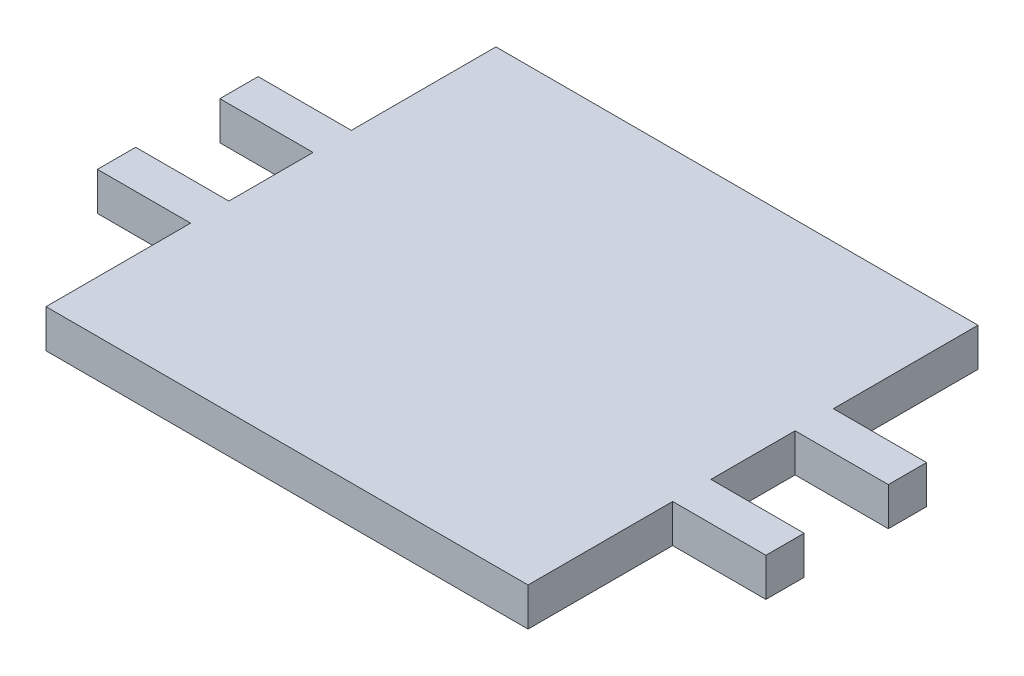
ISO-10303-21;
HEADER;
FILE_DESCRIPTION(('STEP AP214'),'2;1');
FILE_NAME('part.step','',(''),(''),'','','');
FILE_SCHEMA(('AUTOMOTIVE_DESIGN { 1 0 10303 214 1 1 1 1 }'));
ENDSEC;
DATA;
#1=APPLICATION_CONTEXT('core data for automotive mechanical design processes');
#2=APPLICATION_PROTOCOL_DEFINITION('international standard','automotive_design',2000,#1);
#3=PRODUCT_CONTEXT('',#1,'mechanical');
#4=PRODUCT('Part','Part','',(#3));
#5=PRODUCT_RELATED_PRODUCT_CATEGORY('part','',(#4));
#6=PRODUCT_DEFINITION_FORMATION('','',#4);
#7=PRODUCT_DEFINITION_CONTEXT('part definition',#1,'design');
#8=PRODUCT_DEFINITION('design','',#6,#7);
#9=PRODUCT_DEFINITION_SHAPE('','',#8);
#10=(LENGTH_UNIT() NAMED_UNIT(*) SI_UNIT(.MILLI.,.METRE.));
#11=(NAMED_UNIT(*) PLANE_ANGLE_UNIT() SI_UNIT($,.RADIAN.));
#12=(NAMED_UNIT(*) SI_UNIT($,.STERADIAN.) SOLID_ANGLE_UNIT());
#13=UNCERTAINTY_MEASURE_WITH_UNIT(LENGTH_MEASURE(1.E-05),#10,'distance_accuracy_value','');
#14=(GEOMETRIC_REPRESENTATION_CONTEXT(3) GLOBAL_UNCERTAINTY_ASSIGNED_CONTEXT((#13)) GLOBAL_UNIT_ASSIGNED_CONTEXT((#10,
#11,#12)) REPRESENTATION_CONTEXT('',''));
#15=CARTESIAN_POINT('',(0.,0.,0.));
#16=DIRECTION('',(0.,0.,1.));
#17=DIRECTION('',(1.,0.,0.));
#18=AXIS2_PLACEMENT_3D('',#15,#16,#17);
#19=CARTESIAN_POINT('',(38.1,6.0452,0.));
#20=DIRECTION('',(1.,0.,0.));
#21=DIRECTION('',(0.,0.,-1.));
#22=AXIS2_PLACEMENT_3D('',#19,#20,#21);
#23=PLANE('',#22);
#24=DIRECTION('',(0.,0.,1.));
#25=VECTOR('',#24,1.);
#26=CARTESIAN_POINT('',(38.1,0.,0.));
#27=LINE('',#26,#25);
#28=CARTESIAN_POINT('',(38.1,0.,-35.56));
#29=VERTEX_POINT('',#28);
#30=CARTESIAN_POINT('',(38.1,0.,-12.7));
#31=VERTEX_POINT('',#30);
#32=EDGE_CURVE('E219',#29,#31,#27,.T.);
#33=ORIENTED_EDGE('',*,*,#32,.F.);
#34=DIRECTION('',(0.,-1.,0.));
#35=VECTOR('',#34,1.);
#36=CARTESIAN_POINT('',(38.1,6.0452,-35.56));
#37=LINE('',#36,#35);
#38=CARTESIAN_POINT('',(38.1,6.0452,-35.56));
#39=VERTEX_POINT('',#38);
#40=EDGE_CURVE('E11',#39,#29,#37,.T.);
#41=ORIENTED_EDGE('',*,*,#40,.F.);
#42=DIRECTION('',(0.,0.,1.));
#43=VECTOR('',#42,1.);
#44=CARTESIAN_POINT('',(38.1,6.0452,0.));
#45=LINE('',#44,#43);
#46=CARTESIAN_POINT('',(38.1,6.0452,-12.7));
#47=VERTEX_POINT('',#46);
#48=EDGE_CURVE('E279',#39,#47,#45,.T.);
#49=ORIENTED_EDGE('',*,*,#48,.T.);
#50=DIRECTION('',(0.,-1.,0.));
#51=VECTOR('',#50,1.);
#52=CARTESIAN_POINT('',(38.1,6.0452,-12.7));
#53=LINE('',#52,#51);
#54=EDGE_CURVE('E137',#47,#31,#53,.T.);
#55=ORIENTED_EDGE('',*,*,#54,.T.);
#56=EDGE_LOOP('',(#33,#41,#49,#55));
#57=FACE_BOUND('',#56,.T.);
#58=ADVANCED_FACE('F49',(#57),#23,.T.);
#59=CARTESIAN_POINT('',(0.,6.0452,-35.56));
#60=DIRECTION('',(0.,0.,-1.));
#61=DIRECTION('',(-1.,0.,0.));
#62=AXIS2_PLACEMENT_3D('',#59,#60,#61);
#63=PLANE('',#62);
#64=DIRECTION('',(1.,0.,0.));
#65=VECTOR('',#64,1.);
#66=CARTESIAN_POINT('',(0.,0.,-35.56));
#67=LINE('',#66,#65);
#68=CARTESIAN_POINT('',(-38.1,0.,-35.56));
#69=VERTEX_POINT('',#68);
#70=EDGE_CURVE('E223',#69,#29,#67,.T.);
#71=ORIENTED_EDGE('',*,*,#70,.F.);
#72=DIRECTION('',(0.,-1.,0.));
#73=VECTOR('',#72,1.);
#74=CARTESIAN_POINT('',(-38.1,6.0452,-35.56));
#75=LINE('',#74,#73);
#76=CARTESIAN_POINT('',(-38.1,6.0452,-35.56));
#77=VERTEX_POINT('',#76);
#78=EDGE_CURVE('E59',#77,#69,#75,.T.);
#79=ORIENTED_EDGE('',*,*,#78,.F.);
#80=DIRECTION('',(1.,0.,0.));
#81=VECTOR('',#80,1.);
#82=CARTESIAN_POINT('',(0.,6.0452,-35.56));
#83=LINE('',#82,#81);
#84=EDGE_CURVE('E347',#77,#39,#83,.T.);
#85=ORIENTED_EDGE('',*,*,#84,.T.);
#86=ORIENTED_EDGE('',*,*,#40,.T.);
#87=EDGE_LOOP('',(#71,#79,#85,#86));
#88=FACE_BOUND('',#87,.T.);
#89=ADVANCED_FACE('F51',(#88),#63,.T.);
#90=CARTESIAN_POINT('',(-38.1,6.0452,0.));
#91=DIRECTION('',(1.,0.,0.));
#92=DIRECTION('',(0.,0.,-1.));
#93=AXIS2_PLACEMENT_3D('',#90,#91,#92);
#94=PLANE('',#93);
#95=DIRECTION('',(0.,0.,1.));
#96=VECTOR('',#95,1.);
#97=CARTESIAN_POINT('',(-38.1,0.,0.));
#98=LINE('',#97,#96);
#99=CARTESIAN_POINT('',(-38.1,0.,-12.7));
#100=VERTEX_POINT('',#99);
#101=EDGE_CURVE('E229',#69,#100,#98,.T.);
#102=ORIENTED_EDGE('',*,*,#101,.T.);
#103=DIRECTION('',(0.,-1.,0.));
#104=VECTOR('',#103,1.);
#105=CARTESIAN_POINT('',(-38.1,6.0452,-12.7));
#106=LINE('',#105,#104);
#107=CARTESIAN_POINT('',(-38.1,6.0452,-12.7));
#108=VERTEX_POINT('',#107);
#109=EDGE_CURVE('E330',#108,#100,#106,.T.);
#110=ORIENTED_EDGE('',*,*,#109,.F.);
#111=DIRECTION('',(0.,0.,1.));
#112=VECTOR('',#111,1.);
#113=CARTESIAN_POINT('',(-38.1,6.0452,0.));
#114=LINE('',#113,#112);
#115=EDGE_CURVE('E338',#77,#108,#114,.T.);
#116=ORIENTED_EDGE('',*,*,#115,.F.);
#117=ORIENTED_EDGE('',*,*,#78,.T.);
#118=EDGE_LOOP('',(#102,#110,#116,#117));
#119=FACE_BOUND('',#118,.T.);
#120=ADVANCED_FACE('F336',(#119),#94,.F.);
#121=CARTESIAN_POINT('',(0.,6.0452,-12.7));
#122=DIRECTION('',(0.,0.,-1.));
#123=DIRECTION('',(-1.,0.,0.));
#124=AXIS2_PLACEMENT_3D('',#121,#122,#123);
#125=PLANE('',#124);
#126=DIRECTION('',(1.,0.,0.));
#127=VECTOR('',#126,1.);
#128=CARTESIAN_POINT('',(0.,0.,-12.7));
#129=LINE('',#128,#127);
#130=CARTESIAN_POINT('',(-52.832,0.,-12.7));
#131=VERTEX_POINT('',#130);
#132=EDGE_CURVE('E233',#131,#100,#129,.T.);
#133=ORIENTED_EDGE('',*,*,#132,.F.);
#134=DIRECTION('',(0.,-1.,0.));
#135=VECTOR('',#134,1.);
#136=CARTESIAN_POINT('',(-52.832,6.0452,-12.7));
#137=LINE('',#136,#135);
#138=CARTESIAN_POINT('',(-52.832,6.0452,-12.7));
#139=VERTEX_POINT('',#138);
#140=EDGE_CURVE('E327',#139,#131,#137,.T.);
#141=ORIENTED_EDGE('',*,*,#140,.F.);
#142=DIRECTION('',(1.,0.,0.));
#143=VECTOR('',#142,1.);
#144=CARTESIAN_POINT('',(0.,6.0452,-12.7));
#145=LINE('',#144,#143);
#146=EDGE_CURVE('E438',#139,#108,#145,.T.);
#147=ORIENTED_EDGE('',*,*,#146,.T.);
#148=ORIENTED_EDGE('',*,*,#109,.T.);
#149=EDGE_LOOP('',(#133,#141,#147,#148));
#150=FACE_BOUND('',#149,.T.);
#151=ADVANCED_FACE('F444',(#150),#125,.T.);
#152=CARTESIAN_POINT('',(-52.832,6.0452,0.));
#153=DIRECTION('',(1.,0.,0.));
#154=DIRECTION('',(0.,0.,-1.));
#155=AXIS2_PLACEMENT_3D('',#152,#153,#154);
#156=PLANE('',#155);
#157=DIRECTION('',(0.,0.,1.));
#158=VECTOR('',#157,1.);
#159=CARTESIAN_POINT('',(-52.832,0.,0.));
#160=LINE('',#159,#158);
#161=CARTESIAN_POINT('',(-52.832,0.,-6.6548));
#162=VERTEX_POINT('',#161);
#163=EDGE_CURVE('E239',#131,#162,#160,.T.);
#164=ORIENTED_EDGE('',*,*,#163,.T.);
#165=DIRECTION('',(0.,-1.,0.));
#166=VECTOR('',#165,1.);
#167=CARTESIAN_POINT('',(-52.832,6.0452,-6.6548));
#168=LINE('',#167,#166);
#169=CARTESIAN_POINT('',(-52.832,6.0452,-6.6548));
#170=VERTEX_POINT('',#169);
#171=EDGE_CURVE('E323',#170,#162,#168,.T.);
#172=ORIENTED_EDGE('',*,*,#171,.F.);
#173=DIRECTION('',(0.,0.,1.));
#174=VECTOR('',#173,1.);
#175=CARTESIAN_POINT('',(-52.832,6.0452,0.));
#176=LINE('',#175,#174);
#177=EDGE_CURVE('E435',#139,#170,#176,.T.);
#178=ORIENTED_EDGE('',*,*,#177,.F.);
#179=ORIENTED_EDGE('',*,*,#140,.T.);
#180=EDGE_LOOP('',(#164,#172,#178,#179));
#181=FACE_BOUND('',#180,.T.);
#182=ADVANCED_FACE('F448',(#181),#156,.F.);
#183=CARTESIAN_POINT('',(0.,6.0452,-6.6548));
#184=DIRECTION('',(0.,0.,-1.));
#185=DIRECTION('',(-1.,0.,0.));
#186=AXIS2_PLACEMENT_3D('',#183,#184,#185);
#187=PLANE('',#186);
#188=DIRECTION('',(1.,0.,0.));
#189=VECTOR('',#188,1.);
#190=CARTESIAN_POINT('',(0.,0.,-6.6548));
#191=LINE('',#190,#189);
#192=CARTESIAN_POINT('',(-38.1,0.,-6.6548));
#193=VERTEX_POINT('',#192);
#194=EDGE_CURVE('E242',#162,#193,#191,.T.);
#195=ORIENTED_EDGE('',*,*,#194,.T.);
#196=DIRECTION('',(0.,-1.,0.));
#197=VECTOR('',#196,1.);
#198=CARTESIAN_POINT('',(-38.1,6.0452,-6.6548));
#199=LINE('',#198,#197);
#200=CARTESIAN_POINT('',(-38.1,6.0452,-6.6548));
#201=VERTEX_POINT('',#200);
#202=EDGE_CURVE('E319',#201,#193,#199,.T.);
#203=ORIENTED_EDGE('',*,*,#202,.F.);
#204=DIRECTION('',(1.,0.,0.));
#205=VECTOR('',#204,1.);
#206=CARTESIAN_POINT('',(0.,6.0452,-6.6548));
#207=LINE('',#206,#205);
#208=EDGE_CURVE('E431',#170,#201,#207,.T.);
#209=ORIENTED_EDGE('',*,*,#208,.F.);
#210=ORIENTED_EDGE('',*,*,#171,.T.);
#211=EDGE_LOOP('',(#195,#203,#209,#210));
#212=FACE_BOUND('',#211,.T.);
#213=ADVANCED_FACE('F451',(#212),#187,.F.);
#214=CARTESIAN_POINT('',(-38.1,0.,6.6548));
#215=VERTEX_POINT('',#214);
#216=EDGE_CURVE('E235',#193,#215,#98,.T.);
#217=ORIENTED_EDGE('',*,*,#216,.T.);
#218=DIRECTION('',(0.,-1.,0.));
#219=VECTOR('',#218,1.);
#220=CARTESIAN_POINT('',(-38.1,6.0452,6.6548));
#221=LINE('',#220,#219);
#222=CARTESIAN_POINT('',(-38.1,6.0452,6.6548));
#223=VERTEX_POINT('',#222);
#224=EDGE_CURVE('E316',#223,#215,#221,.T.);
#225=ORIENTED_EDGE('',*,*,#224,.F.);
#226=EDGE_CURVE('E374',#201,#223,#114,.T.);
#227=ORIENTED_EDGE('',*,*,#226,.F.);
#228=ORIENTED_EDGE('',*,*,#202,.T.);
#229=EDGE_LOOP('',(#217,#225,#227,#228));
#230=FACE_BOUND('',#229,.T.);
#231=ADVANCED_FACE('F414',(#230),#94,.F.);
#232=CARTESIAN_POINT('',(0.,6.0452,6.6548));
#233=DIRECTION('',(0.,0.,-1.));
#234=DIRECTION('',(-1.,0.,0.));
#235=AXIS2_PLACEMENT_3D('',#232,#233,#234);
#236=PLANE('',#235);
#237=DIRECTION('',(1.,0.,0.));
#238=VECTOR('',#237,1.);
#239=CARTESIAN_POINT('',(0.,0.,6.6548));
#240=LINE('',#239,#238);
#241=CARTESIAN_POINT('',(-52.832,0.,6.6548));
#242=VERTEX_POINT('',#241);
#243=EDGE_CURVE('E245',#242,#215,#240,.T.);
#244=ORIENTED_EDGE('',*,*,#243,.F.);
#245=DIRECTION('',(0.,-1.,0.));
#246=VECTOR('',#245,1.);
#247=CARTESIAN_POINT('',(-52.832,6.0452,6.6548));
#248=LINE('',#247,#246);
#249=CARTESIAN_POINT('',(-52.832,6.0452,6.6548));
#250=VERTEX_POINT('',#249);
#251=EDGE_CURVE('E313',#250,#242,#248,.T.);
#252=ORIENTED_EDGE('',*,*,#251,.F.);
#253=DIRECTION('',(1.,0.,0.));
#254=VECTOR('',#253,1.);
#255=CARTESIAN_POINT('',(0.,6.0452,6.6548));
#256=LINE('',#255,#254);
#257=EDGE_CURVE('E425',#250,#223,#256,.T.);
#258=ORIENTED_EDGE('',*,*,#257,.T.);
#259=ORIENTED_EDGE('',*,*,#224,.T.);
#260=EDGE_LOOP('',(#244,#252,#258,#259));
#261=FACE_BOUND('',#260,.T.);
#262=ADVANCED_FACE('F422',(#261),#236,.T.);
#263=CARTESIAN_POINT('',(-52.832,6.0452,0.));
#264=DIRECTION('',(1.,0.,0.));
#265=DIRECTION('',(0.,0.,-1.));
#266=AXIS2_PLACEMENT_3D('',#263,#264,#265);
#267=PLANE('',#266);
#268=DIRECTION('',(0.,0.,1.));
#269=VECTOR('',#268,1.);
#270=CARTESIAN_POINT('',(-52.832,0.,0.));
#271=LINE('',#270,#269);
#272=CARTESIAN_POINT('',(-52.832,0.,12.7));
#273=VERTEX_POINT('',#272);
#274=EDGE_CURVE('E249',#242,#273,#271,.T.);
#275=ORIENTED_EDGE('',*,*,#274,.T.);
#276=DIRECTION('',(0.,-1.,0.));
#277=VECTOR('',#276,1.);
#278=CARTESIAN_POINT('',(-52.832,6.0452,12.7));
#279=LINE('',#278,#277);
#280=CARTESIAN_POINT('',(-52.832,6.0452,12.7));
#281=VERTEX_POINT('',#280);
#282=EDGE_CURVE('E309',#281,#273,#279,.T.);
#283=ORIENTED_EDGE('',*,*,#282,.F.);
#284=DIRECTION('',(0.,0.,1.));
#285=VECTOR('',#284,1.);
#286=CARTESIAN_POINT('',(-52.832,6.0452,0.));
#287=LINE('',#286,#285);
#288=EDGE_CURVE('E427',#250,#281,#287,.T.);
#289=ORIENTED_EDGE('',*,*,#288,.F.);
#290=ORIENTED_EDGE('',*,*,#251,.T.);
#291=EDGE_LOOP('',(#275,#283,#289,#290));
#292=FACE_BOUND('',#291,.T.);
#293=ADVANCED_FACE('F491',(#292),#267,.F.);
#294=CARTESIAN_POINT('',(0.,6.0452,12.7));
#295=DIRECTION('',(0.,0.,-1.));
#296=DIRECTION('',(-1.,0.,0.));
#297=AXIS2_PLACEMENT_3D('',#294,#295,#296);
#298=PLANE('',#297);
#299=DIRECTION('',(1.,0.,0.));
#300=VECTOR('',#299,1.);
#301=CARTESIAN_POINT('',(0.,0.,12.7));
#302=LINE('',#301,#300);
#303=CARTESIAN_POINT('',(-38.1,0.,12.7));
#304=VERTEX_POINT('',#303);
#305=EDGE_CURVE('E252',#273,#304,#302,.T.);
#306=ORIENTED_EDGE('',*,*,#305,.T.);
#307=DIRECTION('',(0.,-1.,0.));
#308=VECTOR('',#307,1.);
#309=CARTESIAN_POINT('',(-38.1,6.0452,12.7));
#310=LINE('',#309,#308);
#311=CARTESIAN_POINT('',(-38.1,6.0452,12.7));
#312=VERTEX_POINT('',#311);
#313=EDGE_CURVE('E305',#312,#304,#310,.T.);
#314=ORIENTED_EDGE('',*,*,#313,.F.);
#315=DIRECTION('',(1.,0.,0.));
#316=VECTOR('',#315,1.);
#317=CARTESIAN_POINT('',(0.,6.0452,12.7));
#318=LINE('',#317,#316);
#319=EDGE_CURVE('E372',#281,#312,#318,.T.);
#320=ORIENTED_EDGE('',*,*,#319,.F.);
#321=ORIENTED_EDGE('',*,*,#282,.T.);
#322=EDGE_LOOP('',(#306,#314,#320,#321));
#323=FACE_BOUND('',#322,.T.);
#324=ADVANCED_FACE('F488',(#323),#298,.F.);
#325=CARTESIAN_POINT('',(-38.1,0.,35.56));
#326=VERTEX_POINT('',#325);
#327=EDGE_CURVE('E234',#304,#326,#98,.T.);
#328=ORIENTED_EDGE('',*,*,#327,.T.);
#329=DIRECTION('',(0.,-1.,0.));
#330=VECTOR('',#329,1.);
#331=CARTESIAN_POINT('',(-38.1,6.0452,35.56));
#332=LINE('',#331,#330);
#333=CARTESIAN_POINT('',(-38.1,6.0452,35.56));
#334=VERTEX_POINT('',#333);
#335=EDGE_CURVE('E301',#334,#326,#332,.T.);
#336=ORIENTED_EDGE('',*,*,#335,.F.);
#337=EDGE_CURVE('E367',#312,#334,#114,.T.);
#338=ORIENTED_EDGE('',*,*,#337,.F.);
#339=ORIENTED_EDGE('',*,*,#313,.T.);
#340=EDGE_LOOP('',(#328,#336,#338,#339));
#341=FACE_BOUND('',#340,.T.);
#342=ADVANCED_FACE('F405',(#341),#94,.F.);
#343=CARTESIAN_POINT('',(0.,6.0452,35.56));
#344=DIRECTION('',(0.,0.,-1.));
#345=DIRECTION('',(-1.,0.,0.));
#346=AXIS2_PLACEMENT_3D('',#343,#344,#345);
#347=PLANE('',#346);
#348=DIRECTION('',(1.,0.,0.));
#349=VECTOR('',#348,1.);
#350=CARTESIAN_POINT('',(0.,0.,35.56));
#351=LINE('',#350,#349);
#352=CARTESIAN_POINT('',(38.1,0.,35.56));
#353=VERTEX_POINT('',#352);
#354=EDGE_CURVE('E255',#326,#353,#351,.T.);
#355=ORIENTED_EDGE('',*,*,#354,.T.);
#356=DIRECTION('',(0.,-1.,0.));
#357=VECTOR('',#356,1.);
#358=CARTESIAN_POINT('',(38.1,6.0452,35.56));
#359=LINE('',#358,#357);
#360=CARTESIAN_POINT('',(38.1,6.0452,35.56));
#361=VERTEX_POINT('',#360);
#362=EDGE_CURVE('E298',#361,#353,#359,.T.);
#363=ORIENTED_EDGE('',*,*,#362,.F.);
#364=DIRECTION('',(1.,0.,0.));
#365=VECTOR('',#364,1.);
#366=CARTESIAN_POINT('',(0.,6.0452,35.56));
#367=LINE('',#366,#365);
#368=EDGE_CURVE('E359',#334,#361,#367,.T.);
#369=ORIENTED_EDGE('',*,*,#368,.F.);
#370=ORIENTED_EDGE('',*,*,#335,.T.);
#371=EDGE_LOOP('',(#355,#363,#369,#370));
#372=FACE_BOUND('',#371,.T.);
#373=ADVANCED_FACE('F401',(#372),#347,.F.);
#374=CARTESIAN_POINT('',(38.1,0.,12.7));
#375=VERTEX_POINT('',#374);
#376=EDGE_CURVE('E225',#375,#353,#27,.T.);
#377=ORIENTED_EDGE('',*,*,#376,.F.);
#378=DIRECTION('',(0.,-1.,0.));
#379=VECTOR('',#378,1.);
#380=CARTESIAN_POINT('',(38.1,6.0452,12.7));
#381=LINE('',#380,#379);
#382=CARTESIAN_POINT('',(38.1,6.0452,12.7));
#383=VERTEX_POINT('',#382);
#384=EDGE_CURVE('E295',#383,#375,#381,.T.);
#385=ORIENTED_EDGE('',*,*,#384,.F.);
#386=EDGE_CURVE('E351',#383,#361,#45,.T.);
#387=ORIENTED_EDGE('',*,*,#386,.T.);
#388=ORIENTED_EDGE('',*,*,#362,.T.);
#389=EDGE_LOOP('',(#377,#385,#387,#388));
#390=FACE_BOUND('',#389,.T.);
#391=ADVANCED_FACE('F399',(#390),#23,.T.);
#392=CARTESIAN_POINT('',(0.,6.0452,12.7));
#393=DIRECTION('',(0.,0.,1.));
#394=DIRECTION('',(1.,0.,0.));
#395=AXIS2_PLACEMENT_3D('',#392,#393,#394);
#396=PLANE('',#395);
#397=DIRECTION('',(-1.,0.,0.));
#398=VECTOR('',#397,1.);
#399=CARTESIAN_POINT('',(0.,0.,12.7));
#400=LINE('',#399,#398);
#401=CARTESIAN_POINT('',(52.832,0.,12.7));
#402=VERTEX_POINT('',#401);
#403=EDGE_CURVE('E259',#402,#375,#400,.T.);
#404=ORIENTED_EDGE('',*,*,#403,.F.);
#405=DIRECTION('',(0.,-1.,0.));
#406=VECTOR('',#405,1.);
#407=CARTESIAN_POINT('',(52.832,6.0452,12.7));
#408=LINE('',#407,#406);
#409=CARTESIAN_POINT('',(52.832,6.0452,12.7));
#410=VERTEX_POINT('',#409);
#411=EDGE_CURVE('E292',#410,#402,#408,.T.);
#412=ORIENTED_EDGE('',*,*,#411,.F.);
#413=DIRECTION('',(-1.,0.,0.));
#414=VECTOR('',#413,1.);
#415=CARTESIAN_POINT('',(0.,6.0452,12.7));
#416=LINE('',#415,#414);
#417=EDGE_CURVE('E358',#410,#383,#416,.T.);
#418=ORIENTED_EDGE('',*,*,#417,.T.);
#419=ORIENTED_EDGE('',*,*,#384,.T.);
#420=EDGE_LOOP('',(#404,#412,#418,#419));
#421=FACE_BOUND('',#420,.T.);
#422=ADVANCED_FACE('F469',(#421),#396,.T.);
#423=CARTESIAN_POINT('',(52.832,6.0452,0.));
#424=DIRECTION('',(1.,0.,0.));
#425=DIRECTION('',(0.,0.,-1.));
#426=AXIS2_PLACEMENT_3D('',#423,#424,#425);
#427=PLANE('',#426);
#428=DIRECTION('',(0.,0.,1.));
#429=VECTOR('',#428,1.);
#430=CARTESIAN_POINT('',(52.832,0.,0.));
#431=LINE('',#430,#429);
#432=CARTESIAN_POINT('',(52.832,0.,6.65479999999998));
#433=VERTEX_POINT('',#432);
#434=EDGE_CURVE('E263',#433,#402,#431,.T.);
#435=ORIENTED_EDGE('',*,*,#434,.F.);
#436=DIRECTION('',(0.,-1.,0.));
#437=VECTOR('',#436,1.);
#438=CARTESIAN_POINT('',(52.832,6.0452,6.65479999999998));
#439=LINE('',#438,#437);
#440=CARTESIAN_POINT('',(52.832,6.0452,6.65479999999998));
#441=VERTEX_POINT('',#440);
#442=EDGE_CURVE('E289',#441,#433,#439,.T.);
#443=ORIENTED_EDGE('',*,*,#442,.F.);
#444=DIRECTION('',(0.,0.,1.));
#445=VECTOR('',#444,1.);
#446=CARTESIAN_POINT('',(52.832,6.0452,0.));
#447=LINE('',#446,#445);
#448=EDGE_CURVE('E365',#441,#410,#447,.T.);
#449=ORIENTED_EDGE('',*,*,#448,.T.);
#450=ORIENTED_EDGE('',*,*,#411,.T.);
#451=EDGE_LOOP('',(#435,#443,#449,#450));
#452=FACE_BOUND('',#451,.T.);
#453=ADVANCED_FACE('F475',(#452),#427,.T.);
#454=CARTESIAN_POINT('',(0.,6.0452,6.6548));
#455=DIRECTION('',(0.,0.,1.));
#456=DIRECTION('',(1.,0.,0.));
#457=AXIS2_PLACEMENT_3D('',#454,#455,#456);
#458=PLANE('',#457);
#459=DIRECTION('',(-1.,0.,0.));
#460=VECTOR('',#459,1.);
#461=CARTESIAN_POINT('',(0.,0.,6.6548));
#462=LINE('',#461,#460);
#463=CARTESIAN_POINT('',(38.1,0.,6.65479999999999));
#464=VERTEX_POINT('',#463);
#465=EDGE_CURVE('E267',#433,#464,#462,.T.);
#466=ORIENTED_EDGE('',*,*,#465,.T.);
#467=DIRECTION('',(0.,-1.,0.));
#468=VECTOR('',#467,1.);
#469=CARTESIAN_POINT('',(38.1,6.0452,6.65479999999999));
#470=LINE('',#469,#468);
#471=CARTESIAN_POINT('',(38.1,6.0452,6.65479999999999));
#472=VERTEX_POINT('',#471);
#473=EDGE_CURVE('E286',#472,#464,#470,.T.);
#474=ORIENTED_EDGE('',*,*,#473,.F.);
#475=DIRECTION('',(-1.,0.,0.));
#476=VECTOR('',#475,1.);
#477=CARTESIAN_POINT('',(0.,6.0452,6.6548));
#478=LINE('',#477,#476);
#479=EDGE_CURVE('E355',#441,#472,#478,.T.);
#480=ORIENTED_EDGE('',*,*,#479,.F.);
#481=ORIENTED_EDGE('',*,*,#442,.T.);
#482=EDGE_LOOP('',(#466,#474,#480,#481));
#483=FACE_BOUND('',#482,.T.);
#484=ADVANCED_FACE('F386',(#483),#458,.F.);
#485=CARTESIAN_POINT('',(38.1,0.,-6.65480000000001));
#486=VERTEX_POINT('',#485);
#487=EDGE_CURVE('E224',#486,#464,#27,.T.);
#488=ORIENTED_EDGE('',*,*,#487,.F.);
#489=DIRECTION('',(0.,-1.,0.));
#490=VECTOR('',#489,1.);
#491=CARTESIAN_POINT('',(38.1,6.0452,-6.65480000000001));
#492=LINE('',#491,#490);
#493=CARTESIAN_POINT('',(38.1,6.0452,-6.65480000000001));
#494=VERTEX_POINT('',#493);
#495=EDGE_CURVE('E203',#494,#486,#492,.T.);
#496=ORIENTED_EDGE('',*,*,#495,.F.);
#497=EDGE_CURVE('E209',#494,#472,#45,.T.);
#498=ORIENTED_EDGE('',*,*,#497,.T.);
#499=ORIENTED_EDGE('',*,*,#473,.T.);
#500=EDGE_LOOP('',(#488,#496,#498,#499));
#501=FACE_BOUND('',#500,.T.);
#502=ADVANCED_FACE('F391',(#501),#23,.T.);
#503=CARTESIAN_POINT('',(0.,6.0452,-6.6548));
#504=DIRECTION('',(0.,0.,1.));
#505=DIRECTION('',(1.,0.,0.));
#506=AXIS2_PLACEMENT_3D('',#503,#504,#505);
#507=PLANE('',#506);
#508=DIRECTION('',(-1.,0.,0.));
#509=VECTOR('',#508,1.);
#510=CARTESIAN_POINT('',(0.,0.,-6.6548));
#511=LINE('',#510,#509);
#512=CARTESIAN_POINT('',(52.832,0.,-6.65480000000001));
#513=VERTEX_POINT('',#512);
#514=EDGE_CURVE('E197',#513,#486,#511,.T.);
#515=ORIENTED_EDGE('',*,*,#514,.F.);
#516=DIRECTION('',(0.,-1.,0.));
#517=VECTOR('',#516,1.);
#518=CARTESIAN_POINT('',(52.832,6.0452,-6.65480000000001));
#519=LINE('',#518,#517);
#520=CARTESIAN_POINT('',(52.832,6.0452,-6.65480000000001));
#521=VERTEX_POINT('',#520);
#522=EDGE_CURVE('E192',#521,#513,#519,.T.);
#523=ORIENTED_EDGE('',*,*,#522,.F.);
#524=DIRECTION('',(-1.,0.,0.));
#525=VECTOR('',#524,1.);
#526=CARTESIAN_POINT('',(0.,6.0452,-6.6548));
#527=LINE('',#526,#525);
#528=EDGE_CURVE('E195',#521,#494,#527,.T.);
#529=ORIENTED_EDGE('',*,*,#528,.T.);
#530=ORIENTED_EDGE('',*,*,#495,.T.);
#531=EDGE_LOOP('',(#515,#523,#529,#530));
#532=FACE_BOUND('',#531,.T.);
#533=ADVANCED_FACE('F194',(#532),#507,.T.);
#534=CARTESIAN_POINT('',(52.832,6.0452,-1.21284868236362E-13));
#535=DIRECTION('',(1.,0.,0.));
#536=DIRECTION('',(0.,0.,-1.));
#537=AXIS2_PLACEMENT_3D('',#534,#535,#536);
#538=PLANE('',#537);
#539=DIRECTION('',(0.,0.,1.));
#540=VECTOR('',#539,1.);
#541=CARTESIAN_POINT('',(52.832,0.,-1.21284868236362E-13));
#542=LINE('',#541,#540);
#543=CARTESIAN_POINT('',(52.832,0.,-12.7));
#544=VERTEX_POINT('',#543);
#545=EDGE_CURVE('E273',#544,#513,#542,.T.);
#546=ORIENTED_EDGE('',*,*,#545,.F.);
#547=DIRECTION('',(0.,-1.,0.));
#548=VECTOR('',#547,1.);
#549=CARTESIAN_POINT('',(52.832,6.0452,-12.7));
#550=LINE('',#549,#548);
#551=CARTESIAN_POINT('',(52.832,6.0452,-12.7));
#552=VERTEX_POINT('',#551);
#553=EDGE_CURVE('E130',#552,#544,#550,.T.);
#554=ORIENTED_EDGE('',*,*,#553,.F.);
#555=DIRECTION('',(0.,0.,1.));
#556=VECTOR('',#555,1.);
#557=CARTESIAN_POINT('',(52.832,6.0452,-1.21284868236362E-13));
#558=LINE('',#557,#556);
#559=EDGE_CURVE('E207',#552,#521,#558,.T.);
#560=ORIENTED_EDGE('',*,*,#559,.T.);
#561=ORIENTED_EDGE('',*,*,#522,.T.);
#562=EDGE_LOOP('',(#546,#554,#560,#561));
#563=FACE_BOUND('',#562,.T.);
#564=ADVANCED_FACE('F212',(#563),#538,.T.);
#565=CARTESIAN_POINT('',(0.,6.0452,-12.7));
#566=DIRECTION('',(0.,0.,1.));
#567=DIRECTION('',(1.,0.,0.));
#568=AXIS2_PLACEMENT_3D('',#565,#566,#567);
#569=PLANE('',#568);
#570=DIRECTION('',(-1.,0.,0.));
#571=VECTOR('',#570,1.);
#572=CARTESIAN_POINT('',(0.,0.,-12.7));
#573=LINE('',#572,#571);
#574=EDGE_CURVE('E276',#544,#31,#573,.T.);
#575=ORIENTED_EDGE('',*,*,#574,.T.);
#576=ORIENTED_EDGE('',*,*,#54,.F.);
#577=DIRECTION('',(-1.,0.,0.));
#578=VECTOR('',#577,1.);
#579=CARTESIAN_POINT('',(0.,6.0452,-12.7));
#580=LINE('',#579,#578);
#581=EDGE_CURVE('E67',#552,#47,#580,.T.);
#582=ORIENTED_EDGE('',*,*,#581,.F.);
#583=ORIENTED_EDGE('',*,*,#553,.T.);
#584=EDGE_LOOP('',(#575,#576,#582,#583));
#585=FACE_BOUND('',#584,.T.);
#586=ADVANCED_FACE('F348',(#585),#569,.F.);
#587=CARTESIAN_POINT('',(0.,6.0452,0.));
#588=DIRECTION('',(0.,1.,0.));
#589=DIRECTION('',(0.,0.,1.));
#590=AXIS2_PLACEMENT_3D('',#587,#588,#589);
#591=PLANE('',#590);
#592=ORIENTED_EDGE('',*,*,#48,.F.);
#593=ORIENTED_EDGE('',*,*,#84,.F.);
#594=ORIENTED_EDGE('',*,*,#115,.T.);
#595=ORIENTED_EDGE('',*,*,#146,.F.);
#596=ORIENTED_EDGE('',*,*,#177,.T.);
#597=ORIENTED_EDGE('',*,*,#208,.T.);
#598=ORIENTED_EDGE('',*,*,#226,.T.);
#599=ORIENTED_EDGE('',*,*,#257,.F.);
#600=ORIENTED_EDGE('',*,*,#288,.T.);
#601=ORIENTED_EDGE('',*,*,#319,.T.);
#602=ORIENTED_EDGE('',*,*,#337,.T.);
#603=ORIENTED_EDGE('',*,*,#368,.T.);
#604=ORIENTED_EDGE('',*,*,#386,.F.);
#605=ORIENTED_EDGE('',*,*,#417,.F.);
#606=ORIENTED_EDGE('',*,*,#448,.F.);
#607=ORIENTED_EDGE('',*,*,#479,.T.);
#608=ORIENTED_EDGE('',*,*,#497,.F.);
#609=ORIENTED_EDGE('',*,*,#528,.F.);
#610=ORIENTED_EDGE('',*,*,#559,.F.);
#611=ORIENTED_EDGE('',*,*,#581,.T.);
#612=EDGE_LOOP('',(#592,#593,#594,#595,#596,#597,#598,#599,#600,#601,#602,#603,#604,#605,#606,
#607,#608,#609,#610,#611));
#613=FACE_BOUND('',#612,.T.);
#614=ADVANCED_FACE('F206',(#613),#591,.T.);
#615=CARTESIAN_POINT('',(0.,0.,0.));
#616=DIRECTION('',(0.,1.,0.));
#617=DIRECTION('',(0.,0.,1.));
#618=AXIS2_PLACEMENT_3D('',#615,#616,#617);
#619=PLANE('',#618);
#620=ORIENTED_EDGE('',*,*,#32,.T.);
#621=ORIENTED_EDGE('',*,*,#574,.F.);
#622=ORIENTED_EDGE('',*,*,#545,.T.);
#623=ORIENTED_EDGE('',*,*,#514,.T.);
#624=ORIENTED_EDGE('',*,*,#487,.T.);
#625=ORIENTED_EDGE('',*,*,#465,.F.);
#626=ORIENTED_EDGE('',*,*,#434,.T.);
#627=ORIENTED_EDGE('',*,*,#403,.T.);
#628=ORIENTED_EDGE('',*,*,#376,.T.);
#629=ORIENTED_EDGE('',*,*,#354,.F.);
#630=ORIENTED_EDGE('',*,*,#327,.F.);
#631=ORIENTED_EDGE('',*,*,#305,.F.);
#632=ORIENTED_EDGE('',*,*,#274,.F.);
#633=ORIENTED_EDGE('',*,*,#243,.T.);
#634=ORIENTED_EDGE('',*,*,#216,.F.);
#635=ORIENTED_EDGE('',*,*,#194,.F.);
#636=ORIENTED_EDGE('',*,*,#163,.F.);
#637=ORIENTED_EDGE('',*,*,#132,.T.);
#638=ORIENTED_EDGE('',*,*,#101,.F.);
#639=ORIENTED_EDGE('',*,*,#70,.T.);
#640=EDGE_LOOP('',(#620,#621,#622,#623,#624,#625,#626,#627,#628,#629,#630,#631,#632,#633,#634,
#635,#636,#637,#638,#639));
#641=FACE_BOUND('',#640,.T.);
#642=ADVANCED_FACE('F344',(#641),#619,.F.);
#643=CLOSED_SHELL('',(#58,#89,#120,#151,#182,#213,#231,#262,#293,#324,#342,#373,#391,#422,#453,
#484,#502,#533,#564,#586,#614,#642));
#644=MANIFOLD_SOLID_BREP('B2',#643);
#645=ADVANCED_BREP_SHAPE_REPRESENTATION('',(#18,#644),#14);
#646=SHAPE_DEFINITION_REPRESENTATION(#9,#645);
ENDSEC;
END-ISO-10303-21;
